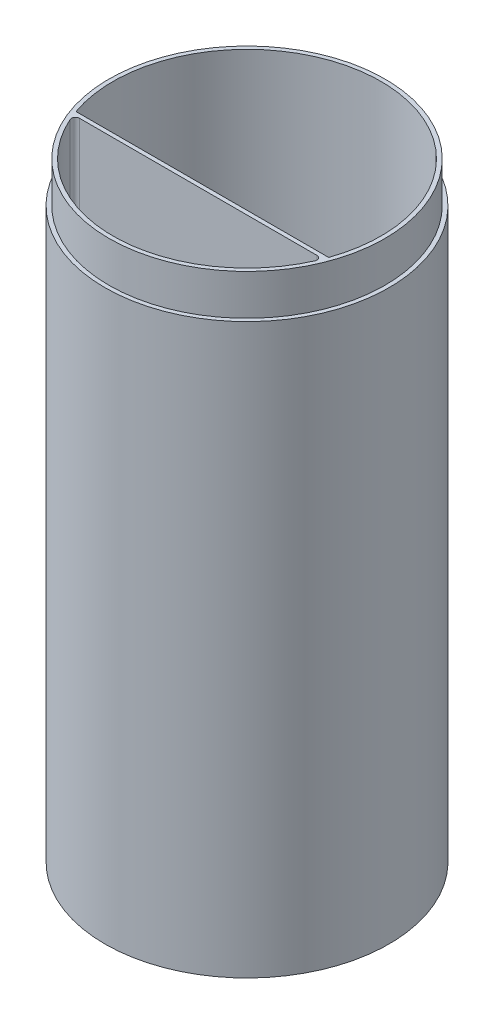
ISO-10303-21;
HEADER;
FILE_DESCRIPTION(('STEP AP214'),'2;1');
FILE_NAME('part.step','',(''),(''),'','','');
FILE_SCHEMA(('AUTOMOTIVE_DESIGN { 1 0 10303 214 1 1 1 1 }'));
ENDSEC;
DATA;
#1=APPLICATION_CONTEXT('core data for automotive mechanical design processes');
#2=APPLICATION_PROTOCOL_DEFINITION('international standard','automotive_design',2000,#1);
#3=PRODUCT_CONTEXT('',#1,'mechanical');
#4=PRODUCT('Part','Part','',(#3));
#5=PRODUCT_RELATED_PRODUCT_CATEGORY('part','',(#4));
#6=PRODUCT_DEFINITION_FORMATION('','',#4);
#7=PRODUCT_DEFINITION_CONTEXT('part definition',#1,'design');
#8=PRODUCT_DEFINITION('design','',#6,#7);
#9=PRODUCT_DEFINITION_SHAPE('','',#8);
#10=(LENGTH_UNIT() NAMED_UNIT(*) SI_UNIT(.MILLI.,.METRE.));
#11=(NAMED_UNIT(*) PLANE_ANGLE_UNIT() SI_UNIT($,.RADIAN.));
#12=(NAMED_UNIT(*) SI_UNIT($,.STERADIAN.) SOLID_ANGLE_UNIT());
#13=UNCERTAINTY_MEASURE_WITH_UNIT(LENGTH_MEASURE(1.E-05),#10,'distance_accuracy_value','');
#14=(GEOMETRIC_REPRESENTATION_CONTEXT(3) GLOBAL_UNCERTAINTY_ASSIGNED_CONTEXT((#13)) GLOBAL_UNIT_ASSIGNED_CONTEXT((#10,
#11,#12)) REPRESENTATION_CONTEXT('',''));
#15=CARTESIAN_POINT('',(0.,0.,0.));
#16=DIRECTION('',(0.,0.,1.));
#17=DIRECTION('',(1.,0.,0.));
#18=AXIS2_PLACEMENT_3D('',#15,#16,#17);
#19=CARTESIAN_POINT('',(-31.4483703870328,150.,10.));
#20=DIRECTION('',(0.,0.,-1.));
#21=DIRECTION('',(-1.,0.,0.));
#22=AXIS2_PLACEMENT_3D('',#19,#20,#21);
#23=PLANE('',#22);
#24=DIRECTION('',(0.,1.,0.));
#25=VECTOR('',#24,1.);
#26=CARTESIAN_POINT('',(-30.7083050655682,150.,10.));
#27=LINE('',#26,#25);
#28=CARTESIAN_POINT('',(-30.7083050655682,0.,10.));
#29=VERTEX_POINT('',#28);
#30=CARTESIAN_POINT('',(-30.7083050655682,140.,10.));
#31=VERTEX_POINT('',#30);
#32=EDGE_CURVE('E463',#29,#31,#27,.T.);
#33=ORIENTED_EDGE('',*,*,#32,.T.);
#34=DIRECTION('',(-1.,0.,0.));
#35=VECTOR('',#34,1.);
#36=CARTESIAN_POINT('',(0.,140.,10.));
#37=LINE('',#36,#35);
#38=CARTESIAN_POINT('',(30.7083050655682,140.,10.));
#39=VERTEX_POINT('',#38);
#40=EDGE_CURVE('E92',#39,#31,#37,.T.);
#41=ORIENTED_EDGE('',*,*,#40,.F.);
#42=DIRECTION('',(0.,1.,0.));
#43=VECTOR('',#42,1.);
#44=CARTESIAN_POINT('',(30.7083050655682,0.,10.));
#45=LINE('',#44,#43);
#46=CARTESIAN_POINT('',(30.7083050655682,0.,10.));
#47=VERTEX_POINT('',#46);
#48=EDGE_CURVE('E467',#39,#47,#45,.F.);
#49=ORIENTED_EDGE('',*,*,#48,.T.);
#50=DIRECTION('',(1.,0.,0.));
#51=VECTOR('',#50,1.);
#52=CARTESIAN_POINT('',(-31.4483703870328,0.,10.));
#53=LINE('',#52,#51);
#54=EDGE_CURVE('E453',#29,#47,#53,.T.);
#55=ORIENTED_EDGE('',*,*,#54,.F.);
#56=EDGE_LOOP('',(#33,#41,#49,#55));
#57=FACE_BOUND('',#56,.T.);
#58=DIRECTION('',(1.,0.,0.));
#59=VECTOR('',#58,1.);
#60=CARTESIAN_POINT('',(-23.25,75.,10.));
#61=LINE('',#60,#59);
#62=CARTESIAN_POINT('',(-23.25,75.,10.));
#63=VERTEX_POINT('',#62);
#64=CARTESIAN_POINT('',(23.25,75.,10.));
#65=VERTEX_POINT('',#64);
#66=EDGE_CURVE('E260',#63,#65,#61,.T.);
#67=ORIENTED_EDGE('',*,*,#66,.F.);
#68=DIRECTION('',(0.,-1.,0.));
#69=VECTOR('',#68,1.);
#70=CARTESIAN_POINT('',(-23.25,11.,10.));
#71=LINE('',#70,#69);
#72=CARTESIAN_POINT('',(-23.25,5.,10.));
#73=VERTEX_POINT('',#72);
#74=EDGE_CURVE('E370',#63,#73,#71,.T.);
#75=ORIENTED_EDGE('',*,*,#74,.T.);
#76=DIRECTION('',(-1.,0.,0.));
#77=VECTOR('',#76,1.);
#78=CARTESIAN_POINT('',(-23.25,5.,10.));
#79=LINE('',#78,#77);
#80=CARTESIAN_POINT('',(23.25,5.,10.));
#81=VERTEX_POINT('',#80);
#82=EDGE_CURVE('E84',#81,#73,#79,.T.);
#83=ORIENTED_EDGE('',*,*,#82,.F.);
#84=DIRECTION('',(0.,-1.,0.));
#85=VECTOR('',#84,1.);
#86=CARTESIAN_POINT('',(23.25,11.,10.));
#87=LINE('',#86,#85);
#88=EDGE_CURVE('E373',#65,#81,#87,.T.);
#89=ORIENTED_EDGE('',*,*,#88,.F.);
#90=EDGE_LOOP('',(#67,#75,#83,#89));
#91=FACE_BOUND('',#90,.T.);
#92=ADVANCED_FACE('F68',(#57,#91),#23,.T.);
#93=CARTESIAN_POINT('',(0.,150.,0.));
#94=DIRECTION('',(0.,1.,0.));
#95=DIRECTION('',(0.,0.,1.));
#96=AXIS2_PLACEMENT_3D('',#93,#94,#95);
#97=PLANE('',#96);
#98=DIRECTION('',(1.,0.,0.));
#99=VECTOR('',#98,1.);
#100=CARTESIAN_POINT('',(0.,150.,11.));
#101=LINE('',#100,#99);
#102=CARTESIAN_POINT('',(-31.1126983722081,150.,11.));
#103=VERTEX_POINT('',#102);
#104=CARTESIAN_POINT('',(31.1126983722081,150.,11.));
#105=VERTEX_POINT('',#104);
#106=EDGE_CURVE('E369',#103,#105,#101,.T.);
#107=ORIENTED_EDGE('',*,*,#106,.F.);
#108=CARTESIAN_POINT('',(0.,150.,0.));
#109=DIRECTION('',(0.,1.,0.));
#110=DIRECTION('',(0.,0.,1.));
#111=AXIS2_PLACEMENT_3D('',#108,#109,#110);
#112=CIRCLE('',#111,33.);
#113=EDGE_CURVE('E449',#105,#103,#112,.T.);
#114=ORIENTED_EDGE('',*,*,#113,.F.);
#115=EDGE_LOOP('',(#107,#114));
#116=FACE_BOUND('',#115,.T.);
#117=DIRECTION('',(-1.,0.,0.));
#118=VECTOR('',#117,1.);
#119=CARTESIAN_POINT('',(-30.7408522978788,150.,12.));
#120=LINE('',#119,#118);
#121=CARTESIAN_POINT('',(29.2403830344269,150.,12.));
#122=VERTEX_POINT('',#121);
#123=CARTESIAN_POINT('',(-29.2403830344269,150.,12.));
#124=VERTEX_POINT('',#123);
#125=EDGE_CURVE('E437',#122,#124,#120,.T.);
#126=ORIENTED_EDGE('',*,*,#125,.F.);
#127=CARTESIAN_POINT('',(29.2403830344269,150.,13.));
#128=DIRECTION('',(0.,1.,0.));
#129=DIRECTION('',(0.,0.,1.));
#130=AXIS2_PLACEMENT_3D('',#127,#128,#129);
#131=CIRCLE('',#130,1.);
#132=CARTESIAN_POINT('',(30.1541450042527,150.,13.40625));
#133=VERTEX_POINT('',#132);
#134=EDGE_CURVE('E500',#122,#133,#131,.F.);
#135=ORIENTED_EDGE('',*,*,#134,.T.);
#136=CARTESIAN_POINT('',(0.,150.,0.));
#137=DIRECTION('',(0.,1.,0.));
#138=DIRECTION('',(0.,0.,1.));
#139=AXIS2_PLACEMENT_3D('',#136,#137,#138);
#140=CIRCLE('',#139,33.);
#141=CARTESIAN_POINT('',(-30.1541450042527,150.,13.40625));
#142=VERTEX_POINT('',#141);
#143=EDGE_CURVE('E433',#142,#133,#140,.T.);
#144=ORIENTED_EDGE('',*,*,#143,.F.);
#145=CARTESIAN_POINT('',(-29.2403830344269,150.,13.));
#146=DIRECTION('',(0.,1.,0.));
#147=DIRECTION('',(0.,0.,1.));
#148=AXIS2_PLACEMENT_3D('',#145,#146,#147);
#149=CIRCLE('',#148,1.);
#150=EDGE_CURVE('E12',#142,#124,#149,.F.);
#151=ORIENTED_EDGE('',*,*,#150,.T.);
#152=EDGE_LOOP('',(#126,#135,#144,#151));
#153=FACE_BOUND('',#152,.T.);
#154=CARTESIAN_POINT('',(0.,150.,0.));
#155=DIRECTION('',(0.,1.,0.));
#156=DIRECTION('',(0.,0.,1.));
#157=AXIS2_PLACEMENT_3D('',#154,#155,#156);
#158=CIRCLE('',#157,34.);
#159=CARTESIAN_POINT('',(0.,150.,34.));
#160=VERTEX_POINT('',#159);
#161=EDGE_CURVE('E417',#160,#160,#158,.T.);
#162=ORIENTED_EDGE('',*,*,#161,.T.);
#163=EDGE_LOOP('',(#162));
#164=FACE_BOUND('',#163,.T.);
#165=ADVANCED_FACE('F517',(#116,#153,#164),#97,.T.);
#166=CARTESIAN_POINT('',(0.,150.,0.));
#167=DIRECTION('',(0.,-1.,0.));
#168=DIRECTION('',(0.,0.,-1.));
#169=AXIS2_PLACEMENT_3D('',#166,#167,#168);
#170=CYLINDRICAL_SURFACE('',#169,35.);
#171=CARTESIAN_POINT('',(0.,0.,0.));
#172=DIRECTION('',(0.,1.,0.));
#173=DIRECTION('',(0.,0.,1.));
#174=AXIS2_PLACEMENT_3D('',#171,#172,#173);
#175=CIRCLE('',#174,35.);
#176=CARTESIAN_POINT('',(0.,0.,35.));
#177=VERTEX_POINT('',#176);
#178=EDGE_CURVE('E452',#177,#177,#175,.T.);
#179=ORIENTED_EDGE('',*,*,#178,.T.);
#180=EDGE_LOOP('',(#179));
#181=FACE_BOUND('',#180,.T.);
#182=CARTESIAN_POINT('',(0.,140.,0.));
#183=DIRECTION('',(0.,1.,0.));
#184=DIRECTION('',(0.,0.,1.));
#185=AXIS2_PLACEMENT_3D('',#182,#183,#184);
#186=CIRCLE('',#185,35.);
#187=CARTESIAN_POINT('',(0.,140.,35.));
#188=VERTEX_POINT('',#187);
#189=EDGE_CURVE('E425',#188,#188,#186,.T.);
#190=ORIENTED_EDGE('',*,*,#189,.F.);
#191=EDGE_LOOP('',(#190));
#192=FACE_BOUND('',#191,.T.);
#193=ADVANCED_FACE('F541',(#181,#192),#170,.T.);
#194=CARTESIAN_POINT('',(30.7083050655682,150.,9.));
#195=DIRECTION('',(0.,-1.,0.));
#196=DIRECTION('',(0.,0.,-1.));
#197=AXIS2_PLACEMENT_3D('',#194,#195,#196);
#198=CYLINDRICAL_SURFACE('',#197,1.);
#199=CARTESIAN_POINT('',(30.7083050655682,140.,9.));
#200=DIRECTION('',(0.,1.,0.));
#201=DIRECTION('',(0.,0.,1.));
#202=AXIS2_PLACEMENT_3D('',#199,#200,#201);
#203=CIRCLE('',#202,1.);
#204=CARTESIAN_POINT('',(31.6679395988672,140.,9.28125));
#205=VERTEX_POINT('',#204);
#206=EDGE_CURVE('E397',#205,#39,#203,.F.);
#207=ORIENTED_EDGE('',*,*,#206,.F.);
#208=DIRECTION('',(0.,-1.,0.));
#209=VECTOR('',#208,1.);
#210=CARTESIAN_POINT('',(31.6679395988672,150.,9.28125000000001));
#211=LINE('',#210,#209);
#212=CARTESIAN_POINT('',(31.6679395988672,0.,9.28125));
#213=VERTEX_POINT('',#212);
#214=EDGE_CURVE('E473',#213,#205,#211,.F.);
#215=ORIENTED_EDGE('',*,*,#214,.F.);
#216=CARTESIAN_POINT('',(30.7083050655682,0.,9.));
#217=DIRECTION('',(0.,1.,0.));
#218=DIRECTION('',(0.,0.,1.));
#219=AXIS2_PLACEMENT_3D('',#216,#217,#218);
#220=CIRCLE('',#219,1.);
#221=EDGE_CURVE('E491',#47,#213,#220,.T.);
#222=ORIENTED_EDGE('',*,*,#221,.F.);
#223=ORIENTED_EDGE('',*,*,#48,.F.);
#224=EDGE_LOOP('',(#207,#215,#222,#223));
#225=FACE_BOUND('',#224,.T.);
#226=ADVANCED_FACE('F556',(#225),#198,.F.);
#227=CARTESIAN_POINT('',(-30.7083050655682,150.,9.));
#228=DIRECTION('',(0.,-1.,0.));
#229=DIRECTION('',(0.,0.,-1.));
#230=AXIS2_PLACEMENT_3D('',#227,#228,#229);
#231=CYLINDRICAL_SURFACE('',#230,1.);
#232=CARTESIAN_POINT('',(-30.7083050655682,140.,9.));
#233=DIRECTION('',(0.,1.,0.));
#234=DIRECTION('',(0.,0.,1.));
#235=AXIS2_PLACEMENT_3D('',#232,#233,#234);
#236=CIRCLE('',#235,1.);
#237=CARTESIAN_POINT('',(-31.6679395988672,140.,9.28125000000001));
#238=VERTEX_POINT('',#237);
#239=EDGE_CURVE('E402',#31,#238,#236,.F.);
#240=ORIENTED_EDGE('',*,*,#239,.F.);
#241=ORIENTED_EDGE('',*,*,#32,.F.);
#242=CARTESIAN_POINT('',(-30.7083050655682,0.,9.));
#243=DIRECTION('',(0.,1.,0.));
#244=DIRECTION('',(0.,0.,1.));
#245=AXIS2_PLACEMENT_3D('',#242,#243,#244);
#246=CIRCLE('',#245,1.);
#247=CARTESIAN_POINT('',(-31.6679395988672,0.,9.28125));
#248=VERTEX_POINT('',#247);
#249=EDGE_CURVE('E494',#248,#29,#246,.T.);
#250=ORIENTED_EDGE('',*,*,#249,.F.);
#251=DIRECTION('',(0.,-1.,0.));
#252=VECTOR('',#251,1.);
#253=CARTESIAN_POINT('',(-31.6679395988672,150.,9.28125000000001));
#254=LINE('',#253,#252);
#255=EDGE_CURVE('E470',#238,#248,#254,.T.);
#256=ORIENTED_EDGE('',*,*,#255,.F.);
#257=EDGE_LOOP('',(#240,#241,#250,#256));
#258=FACE_BOUND('',#257,.T.);
#259=ADVANCED_FACE('F552',(#258),#231,.F.);
#260=CARTESIAN_POINT('',(0.,0.,0.));
#261=DIRECTION('',(0.,1.,0.));
#262=DIRECTION('',(0.,0.,1.));
#263=AXIS2_PLACEMENT_3D('',#260,#261,#262);
#264=PLANE('',#263);
#265=ORIENTED_EDGE('',*,*,#54,.T.);
#266=ORIENTED_EDGE('',*,*,#221,.T.);
#267=CARTESIAN_POINT('',(0.,0.,0.));
#268=DIRECTION('',(0.,1.,0.));
#269=DIRECTION('',(0.,0.,1.));
#270=AXIS2_PLACEMENT_3D('',#267,#268,#269);
#271=CIRCLE('',#270,33.);
#272=EDGE_CURVE('E442',#213,#248,#271,.T.);
#273=ORIENTED_EDGE('',*,*,#272,.T.);
#274=ORIENTED_EDGE('',*,*,#249,.T.);
#275=EDGE_LOOP('',(#265,#266,#273,#274));
#276=FACE_BOUND('',#275,.T.);
#277=ORIENTED_EDGE('',*,*,#178,.F.);
#278=EDGE_LOOP('',(#277));
#279=FACE_BOUND('',#278,.T.);
#280=DIRECTION('',(-1.,0.,0.));
#281=VECTOR('',#280,1.);
#282=CARTESIAN_POINT('',(-30.7408522978788,0.,12.));
#283=LINE('',#282,#281);
#284=CARTESIAN_POINT('',(29.2403830344269,0.,12.));
#285=VERTEX_POINT('',#284);
#286=CARTESIAN_POINT('',(-29.2403830344269,0.,12.));
#287=VERTEX_POINT('',#286);
#288=EDGE_CURVE('E438',#285,#287,#283,.T.);
#289=ORIENTED_EDGE('',*,*,#288,.T.);
#290=CARTESIAN_POINT('',(-29.2403830344269,0.,13.));
#291=DIRECTION('',(0.,1.,0.));
#292=DIRECTION('',(0.,0.,1.));
#293=AXIS2_PLACEMENT_3D('',#290,#291,#292);
#294=CIRCLE('',#293,1.);
#295=CARTESIAN_POINT('',(-30.1541450042527,0.,13.40625));
#296=VERTEX_POINT('',#295);
#297=EDGE_CURVE('E77',#287,#296,#294,.T.);
#298=ORIENTED_EDGE('',*,*,#297,.T.);
#299=CARTESIAN_POINT('',(0.,0.,0.));
#300=DIRECTION('',(0.,1.,0.));
#301=DIRECTION('',(0.,0.,1.));
#302=AXIS2_PLACEMENT_3D('',#299,#300,#301);
#303=CIRCLE('',#302,33.);
#304=CARTESIAN_POINT('',(30.1541450042527,0.,13.40625));
#305=VERTEX_POINT('',#304);
#306=EDGE_CURVE('E429',#296,#305,#303,.T.);
#307=ORIENTED_EDGE('',*,*,#306,.T.);
#308=CARTESIAN_POINT('',(29.2403830344269,0.,13.));
#309=DIRECTION('',(0.,1.,0.));
#310=DIRECTION('',(0.,0.,1.));
#311=AXIS2_PLACEMENT_3D('',#308,#309,#310);
#312=CIRCLE('',#311,1.);
#313=EDGE_CURVE('E497',#305,#285,#312,.T.);
#314=ORIENTED_EDGE('',*,*,#313,.T.);
#315=EDGE_LOOP('',(#289,#298,#307,#314));
#316=FACE_BOUND('',#315,.T.);
#317=ADVANCED_FACE('F505',(#276,#279,#316),#264,.F.);
#318=CARTESIAN_POINT('',(0.,150.,0.));
#319=DIRECTION('',(0.,-1.,0.));
#320=DIRECTION('',(0.,0.,-1.));
#321=AXIS2_PLACEMENT_3D('',#318,#319,#320);
#322=CYLINDRICAL_SURFACE('',#321,33.);
#323=ORIENTED_EDGE('',*,*,#272,.F.);
#324=ORIENTED_EDGE('',*,*,#214,.T.);
#325=CARTESIAN_POINT('',(0.,140.,0.));
#326=DIRECTION('',(0.,1.,0.));
#327=DIRECTION('',(0.,0.,1.));
#328=AXIS2_PLACEMENT_3D('',#325,#326,#327);
#329=CIRCLE('',#328,33.);
#330=CARTESIAN_POINT('',(31.1126983722081,140.,11.));
#331=VERTEX_POINT('',#330);
#332=EDGE_CURVE('E394',#331,#205,#329,.T.);
#333=ORIENTED_EDGE('',*,*,#332,.F.);
#334=DIRECTION('',(0.,1.,0.));
#335=VECTOR('',#334,1.);
#336=CARTESIAN_POINT('',(31.1126983722081,140.,11.));
#337=LINE('',#336,#335);
#338=EDGE_CURVE('E409',#331,#105,#337,.T.);
#339=ORIENTED_EDGE('',*,*,#338,.T.);
#340=ORIENTED_EDGE('',*,*,#113,.T.);
#341=DIRECTION('',(0.,1.,0.));
#342=VECTOR('',#341,1.);
#343=CARTESIAN_POINT('',(-31.1126983722081,140.,11.));
#344=LINE('',#343,#342);
#345=CARTESIAN_POINT('',(-31.1126983722081,140.,11.));
#346=VERTEX_POINT('',#345);
#347=EDGE_CURVE('E413',#346,#103,#344,.T.);
#348=ORIENTED_EDGE('',*,*,#347,.F.);
#349=CARTESIAN_POINT('',(0.,140.,0.));
#350=DIRECTION('',(0.,1.,0.));
#351=DIRECTION('',(0.,0.,1.));
#352=AXIS2_PLACEMENT_3D('',#349,#350,#351);
#353=CIRCLE('',#352,33.);
#354=EDGE_CURVE('E405',#238,#346,#353,.T.);
#355=ORIENTED_EDGE('',*,*,#354,.F.);
#356=ORIENTED_EDGE('',*,*,#255,.T.);
#357=EDGE_LOOP('',(#323,#324,#333,#339,#340,#348,#355,#356));
#358=FACE_BOUND('',#357,.T.);
#359=ADVANCED_FACE('F546',(#358),#322,.F.);
#360=CARTESIAN_POINT('',(0.,150.,0.));
#361=DIRECTION('',(0.,-1.,0.));
#362=DIRECTION('',(0.,0.,-1.));
#363=AXIS2_PLACEMENT_3D('',#360,#361,#362);
#364=CYLINDRICAL_SURFACE('',#363,33.);
#365=ORIENTED_EDGE('',*,*,#143,.T.);
#366=DIRECTION('',(0.,-1.,0.));
#367=VECTOR('',#366,1.);
#368=CARTESIAN_POINT('',(30.1541450042527,150.,13.40625));
#369=LINE('',#368,#367);
#370=EDGE_CURVE('E480',#133,#305,#369,.T.);
#371=ORIENTED_EDGE('',*,*,#370,.T.);
#372=ORIENTED_EDGE('',*,*,#306,.F.);
#373=DIRECTION('',(0.,-1.,0.));
#374=VECTOR('',#373,1.);
#375=CARTESIAN_POINT('',(-30.1541450042527,150.,13.40625));
#376=LINE('',#375,#374);
#377=EDGE_CURVE('E477',#296,#142,#376,.F.);
#378=ORIENTED_EDGE('',*,*,#377,.T.);
#379=EDGE_LOOP('',(#365,#371,#372,#378));
#380=FACE_BOUND('',#379,.T.);
#381=ADVANCED_FACE('F511',(#380),#364,.F.);
#382=CARTESIAN_POINT('',(-30.7408522978788,150.,12.));
#383=DIRECTION('',(0.,0.,1.));
#384=DIRECTION('',(1.,0.,0.));
#385=AXIS2_PLACEMENT_3D('',#382,#383,#384);
#386=PLANE('',#385);
#387=ORIENTED_EDGE('',*,*,#288,.F.);
#388=DIRECTION('',(0.,1.,0.));
#389=VECTOR('',#388,1.);
#390=CARTESIAN_POINT('',(29.2403830344269,150.,12.));
#391=LINE('',#390,#389);
#392=EDGE_CURVE('E488',#285,#122,#391,.T.);
#393=ORIENTED_EDGE('',*,*,#392,.T.);
#394=ORIENTED_EDGE('',*,*,#125,.T.);
#395=DIRECTION('',(0.,1.,0.));
#396=VECTOR('',#395,1.);
#397=CARTESIAN_POINT('',(-29.2403830344269,0.,12.));
#398=LINE('',#397,#396);
#399=EDGE_CURVE('E484',#124,#287,#398,.F.);
#400=ORIENTED_EDGE('',*,*,#399,.T.);
#401=EDGE_LOOP('',(#387,#393,#394,#400));
#402=FACE_BOUND('',#401,.T.);
#403=ADVANCED_FACE('F521',(#402),#386,.T.);
#404=CARTESIAN_POINT('',(29.2403830344269,150.,13.));
#405=DIRECTION('',(0.,-1.,0.));
#406=DIRECTION('',(0.,0.,-1.));
#407=AXIS2_PLACEMENT_3D('',#404,#405,#406);
#408=CYLINDRICAL_SURFACE('',#407,1.);
#409=ORIENTED_EDGE('',*,*,#134,.F.);
#410=ORIENTED_EDGE('',*,*,#392,.F.);
#411=ORIENTED_EDGE('',*,*,#313,.F.);
#412=ORIENTED_EDGE('',*,*,#370,.F.);
#413=EDGE_LOOP('',(#409,#410,#411,#412));
#414=FACE_BOUND('',#413,.T.);
#415=ADVANCED_FACE('F524',(#414),#408,.F.);
#416=CARTESIAN_POINT('',(-29.2403830344269,150.,13.));
#417=DIRECTION('',(0.,-1.,0.));
#418=DIRECTION('',(0.,0.,-1.));
#419=AXIS2_PLACEMENT_3D('',#416,#417,#418);
#420=CYLINDRICAL_SURFACE('',#419,1.);
#421=ORIENTED_EDGE('',*,*,#150,.F.);
#422=ORIENTED_EDGE('',*,*,#377,.F.);
#423=ORIENTED_EDGE('',*,*,#297,.F.);
#424=ORIENTED_EDGE('',*,*,#399,.F.);
#425=EDGE_LOOP('',(#421,#422,#423,#424));
#426=FACE_BOUND('',#425,.T.);
#427=ADVANCED_FACE('F70',(#426),#420,.F.);
#428=CARTESIAN_POINT('',(0.,140.,11.));
#429=DIRECTION('',(0.,0.,1.));
#430=DIRECTION('',(1.,0.,0.));
#431=AXIS2_PLACEMENT_3D('',#428,#429,#430);
#432=PLANE('',#431);
#433=ORIENTED_EDGE('',*,*,#106,.T.);
#434=ORIENTED_EDGE('',*,*,#338,.F.);
#435=DIRECTION('',(1.,0.,0.));
#436=VECTOR('',#435,1.);
#437=CARTESIAN_POINT('',(0.,140.,11.));
#438=LINE('',#437,#436);
#439=EDGE_CURVE('E390',#346,#331,#438,.T.);
#440=ORIENTED_EDGE('',*,*,#439,.F.);
#441=ORIENTED_EDGE('',*,*,#347,.T.);
#442=EDGE_LOOP('',(#433,#434,#440,#441));
#443=FACE_BOUND('',#442,.T.);
#444=ADVANCED_FACE('F530',(#443),#432,.F.);
#445=CARTESIAN_POINT('',(0.,140.,0.));
#446=DIRECTION('',(0.,1.,0.));
#447=DIRECTION('',(0.,0.,1.));
#448=AXIS2_PLACEMENT_3D('',#445,#446,#447);
#449=PLANE('',#448);
#450=ORIENTED_EDGE('',*,*,#439,.T.);
#451=ORIENTED_EDGE('',*,*,#332,.T.);
#452=ORIENTED_EDGE('',*,*,#206,.T.);
#453=ORIENTED_EDGE('',*,*,#40,.T.);
#454=ORIENTED_EDGE('',*,*,#239,.T.);
#455=ORIENTED_EDGE('',*,*,#354,.T.);
#456=EDGE_LOOP('',(#450,#451,#452,#453,#454,#455));
#457=FACE_BOUND('',#456,.T.);
#458=ADVANCED_FACE('F576',(#457),#449,.T.);
#459=CARTESIAN_POINT('',(0.,140.,0.));
#460=DIRECTION('',(0.,1.,0.));
#461=DIRECTION('',(0.,0.,1.));
#462=AXIS2_PLACEMENT_3D('',#459,#460,#461);
#463=CYLINDRICAL_SURFACE('',#462,34.);
#464=CARTESIAN_POINT('',(0.,140.,0.));
#465=DIRECTION('',(0.,1.,0.));
#466=DIRECTION('',(0.,0.,1.));
#467=AXIS2_PLACEMENT_3D('',#464,#465,#466);
#468=CIRCLE('',#467,34.);
#469=CARTESIAN_POINT('',(0.,140.,34.));
#470=VERTEX_POINT('',#469);
#471=EDGE_CURVE('E421',#470,#470,#468,.T.);
#472=ORIENTED_EDGE('',*,*,#471,.T.);
#473=EDGE_LOOP('',(#472));
#474=FACE_BOUND('',#473,.T.);
#475=ORIENTED_EDGE('',*,*,#161,.F.);
#476=EDGE_LOOP('',(#475));
#477=FACE_BOUND('',#476,.T.);
#478=ADVANCED_FACE('F585',(#474,#477),#463,.T.);
#479=CARTESIAN_POINT('',(0.,140.,0.));
#480=DIRECTION('',(0.,1.,0.));
#481=DIRECTION('',(0.,0.,1.));
#482=AXIS2_PLACEMENT_3D('',#479,#480,#481);
#483=PLANE('',#482);
#484=ORIENTED_EDGE('',*,*,#471,.F.);
#485=EDGE_LOOP('',(#484));
#486=FACE_BOUND('',#485,.T.);
#487=ORIENTED_EDGE('',*,*,#189,.T.);
#488=EDGE_LOOP('',(#487));
#489=FACE_BOUND('',#488,.T.);
#490=ADVANCED_FACE('F589',(#486,#489),#483,.T.);
#491=CARTESIAN_POINT('',(-11.,11.,0.));
#492=DIRECTION('',(0.,-1.,0.));
#493=DIRECTION('',(0.,0.,-1.));
#494=AXIS2_PLACEMENT_3D('',#491,#492,#493);
#495=CYLINDRICAL_SURFACE('',#494,12.25);
#496=CARTESIAN_POINT('',(-11.,5.,0.));
#497=DIRECTION('',(0.,-1.,0.));
#498=DIRECTION('',(0.,0.,-1.));
#499=AXIS2_PLACEMENT_3D('',#496,#497,#498);
#500=CIRCLE('',#499,12.25);
#501=CARTESIAN_POINT('',(-23.25,5.,0.));
#502=VERTEX_POINT('',#501);
#503=CARTESIAN_POINT('',(-11.,5.,-12.25));
#504=VERTEX_POINT('',#503);
#505=EDGE_CURVE('E332',#502,#504,#500,.T.);
#506=ORIENTED_EDGE('',*,*,#505,.F.);
#507=DIRECTION('',(0.,-1.,0.));
#508=VECTOR('',#507,1.);
#509=CARTESIAN_POINT('',(-23.25,11.,0.));
#510=LINE('',#509,#508);
#511=CARTESIAN_POINT('',(-23.25,75.,0.));
#512=VERTEX_POINT('',#511);
#513=EDGE_CURVE('E366',#512,#502,#510,.T.);
#514=ORIENTED_EDGE('',*,*,#513,.F.);
#515=CARTESIAN_POINT('',(-11.,75.,0.));
#516=DIRECTION('',(0.,1.,0.));
#517=DIRECTION('',(0.,0.,1.));
#518=AXIS2_PLACEMENT_3D('',#515,#516,#517);
#519=CIRCLE('',#518,12.25);
#520=CARTESIAN_POINT('',(-11.,75.,-12.25));
#521=VERTEX_POINT('',#520);
#522=EDGE_CURVE('E252',#521,#512,#519,.T.);
#523=ORIENTED_EDGE('',*,*,#522,.F.);
#524=DIRECTION('',(0.,-1.,0.));
#525=VECTOR('',#524,1.);
#526=CARTESIAN_POINT('',(-11.,11.,-12.25));
#527=LINE('',#526,#525);
#528=EDGE_CURVE('E365',#521,#504,#527,.T.);
#529=ORIENTED_EDGE('',*,*,#528,.T.);
#530=EDGE_LOOP('',(#506,#514,#523,#529));
#531=FACE_BOUND('',#530,.T.);
#532=ADVANCED_FACE('F592',(#531),#495,.T.);
#533=CARTESIAN_POINT('',(-23.25,11.,0.));
#534=DIRECTION('',(-1.,0.,0.));
#535=DIRECTION('',(0.,0.,1.));
#536=AXIS2_PLACEMENT_3D('',#533,#534,#535);
#537=PLANE('',#536);
#538=DIRECTION('',(0.,0.,-1.));
#539=VECTOR('',#538,1.);
#540=CARTESIAN_POINT('',(-23.25,5.,0.));
#541=LINE('',#540,#539);
#542=EDGE_CURVE('E361',#73,#502,#541,.T.);
#543=ORIENTED_EDGE('',*,*,#542,.F.);
#544=ORIENTED_EDGE('',*,*,#74,.F.);
#545=DIRECTION('',(0.,0.,1.));
#546=VECTOR('',#545,1.);
#547=CARTESIAN_POINT('',(-23.25,75.,0.));
#548=LINE('',#547,#546);
#549=EDGE_CURVE('E256',#512,#63,#548,.T.);
#550=ORIENTED_EDGE('',*,*,#549,.F.);
#551=ORIENTED_EDGE('',*,*,#513,.T.);
#552=EDGE_LOOP('',(#543,#544,#550,#551));
#553=FACE_BOUND('',#552,.T.);
#554=ADVANCED_FACE('F622',(#553),#537,.T.);
#555=CARTESIAN_POINT('',(23.25,11.,0.));
#556=DIRECTION('',(1.,0.,0.));
#557=DIRECTION('',(0.,0.,-1.));
#558=AXIS2_PLACEMENT_3D('',#555,#556,#557);
#559=PLANE('',#558);
#560=DIRECTION('',(0.,0.,1.));
#561=VECTOR('',#560,1.);
#562=CARTESIAN_POINT('',(23.25,5.,0.));
#563=LINE('',#562,#561);
#564=CARTESIAN_POINT('',(23.25,5.,0.));
#565=VERTEX_POINT('',#564);
#566=EDGE_CURVE('E355',#565,#81,#563,.T.);
#567=ORIENTED_EDGE('',*,*,#566,.F.);
#568=DIRECTION('',(0.,-1.,0.));
#569=VECTOR('',#568,1.);
#570=CARTESIAN_POINT('',(23.25,11.,0.));
#571=LINE('',#570,#569);
#572=CARTESIAN_POINT('',(23.25,75.,0.));
#573=VERTEX_POINT('',#572);
#574=EDGE_CURVE('E376',#573,#565,#571,.T.);
#575=ORIENTED_EDGE('',*,*,#574,.F.);
#576=DIRECTION('',(0.,0.,-1.));
#577=VECTOR('',#576,1.);
#578=CARTESIAN_POINT('',(23.25,75.,10.));
#579=LINE('',#578,#577);
#580=EDGE_CURVE('E264',#65,#573,#579,.T.);
#581=ORIENTED_EDGE('',*,*,#580,.F.);
#582=ORIENTED_EDGE('',*,*,#88,.T.);
#583=EDGE_LOOP('',(#567,#575,#581,#582));
#584=FACE_BOUND('',#583,.T.);
#585=ADVANCED_FACE('F629',(#584),#559,.T.);
#586=CARTESIAN_POINT('',(11.,11.,0.));
#587=DIRECTION('',(0.,-1.,0.));
#588=DIRECTION('',(0.,0.,-1.));
#589=AXIS2_PLACEMENT_3D('',#586,#587,#588);
#590=CYLINDRICAL_SURFACE('',#589,12.25);
#591=CARTESIAN_POINT('',(11.,5.,0.));
#592=DIRECTION('',(0.,-1.,0.));
#593=DIRECTION('',(0.,0.,-1.));
#594=AXIS2_PLACEMENT_3D('',#591,#592,#593);
#595=CIRCLE('',#594,12.25);
#596=CARTESIAN_POINT('',(11.,5.,-12.25));
#597=VERTEX_POINT('',#596);
#598=EDGE_CURVE('E351',#597,#565,#595,.T.);
#599=ORIENTED_EDGE('',*,*,#598,.F.);
#600=DIRECTION('',(0.,-1.,0.));
#601=VECTOR('',#600,1.);
#602=CARTESIAN_POINT('',(11.,11.,-12.25));
#603=LINE('',#602,#601);
#604=CARTESIAN_POINT('',(11.,75.,-12.25));
#605=VERTEX_POINT('',#604);
#606=EDGE_CURVE('E379',#605,#597,#603,.T.);
#607=ORIENTED_EDGE('',*,*,#606,.F.);
#608=CARTESIAN_POINT('',(11.,75.,0.));
#609=DIRECTION('',(0.,1.,0.));
#610=DIRECTION('',(0.,0.,1.));
#611=AXIS2_PLACEMENT_3D('',#608,#609,#610);
#612=CIRCLE('',#611,12.25);
#613=EDGE_CURVE('E268',#573,#605,#612,.T.);
#614=ORIENTED_EDGE('',*,*,#613,.F.);
#615=ORIENTED_EDGE('',*,*,#574,.T.);
#616=EDGE_LOOP('',(#599,#607,#614,#615));
#617=FACE_BOUND('',#616,.T.);
#618=ADVANCED_FACE('F637',(#617),#590,.T.);
#619=CARTESIAN_POINT('',(7.5,11.,-10.75));
#620=DIRECTION('',(-0.393919298579166,0.,-0.919145030018058));
#621=DIRECTION('',(-0.919145030018058,0.,0.393919298579167));
#622=AXIS2_PLACEMENT_3D('',#619,#620,#621);
#623=PLANE('',#622);
#624=DIRECTION('',(0.919145030018058,0.,-0.393919298579167));
#625=VECTOR('',#624,1.);
#626=CARTESIAN_POINT('',(7.5,5.,-10.75));
#627=LINE('',#626,#625);
#628=CARTESIAN_POINT('',(7.5,5.,-10.75));
#629=VERTEX_POINT('',#628);
#630=EDGE_CURVE('E347',#629,#597,#627,.T.);
#631=ORIENTED_EDGE('',*,*,#630,.F.);
#632=DIRECTION('',(0.,-1.,0.));
#633=VECTOR('',#632,1.);
#634=CARTESIAN_POINT('',(7.5,11.,-10.75));
#635=LINE('',#634,#633);
#636=CARTESIAN_POINT('',(7.5,75.,-10.75));
#637=VERTEX_POINT('',#636);
#638=EDGE_CURVE('E382',#637,#629,#635,.T.);
#639=ORIENTED_EDGE('',*,*,#638,.F.);
#640=DIRECTION('',(-0.919145030018058,0.,0.393919298579167));
#641=VECTOR('',#640,1.);
#642=CARTESIAN_POINT('',(11.,75.,-12.25));
#643=LINE('',#642,#641);
#644=EDGE_CURVE('E272',#605,#637,#643,.T.);
#645=ORIENTED_EDGE('',*,*,#644,.F.);
#646=ORIENTED_EDGE('',*,*,#606,.T.);
#647=EDGE_LOOP('',(#631,#639,#645,#646));
#648=FACE_BOUND('',#647,.T.);
#649=ADVANCED_FACE('F645',(#648),#623,.T.);
#650=CARTESIAN_POINT('',(-7.5,11.,-10.75));
#651=DIRECTION('',(0.,0.,-1.));
#652=DIRECTION('',(-1.,0.,0.));
#653=AXIS2_PLACEMENT_3D('',#650,#651,#652);
#654=PLANE('',#653);
#655=DIRECTION('',(1.,0.,0.));
#656=VECTOR('',#655,1.);
#657=CARTESIAN_POINT('',(-7.5,5.,-10.75));
#658=LINE('',#657,#656);
#659=CARTESIAN_POINT('',(-7.5,5.,-10.75));
#660=VERTEX_POINT('',#659);
#661=EDGE_CURVE('E343',#660,#629,#658,.T.);
#662=ORIENTED_EDGE('',*,*,#661,.F.);
#663=DIRECTION('',(0.,-1.,0.));
#664=VECTOR('',#663,1.);
#665=CARTESIAN_POINT('',(-7.5,11.,-10.75));
#666=LINE('',#665,#664);
#667=CARTESIAN_POINT('',(-7.5,75.,-10.75));
#668=VERTEX_POINT('',#667);
#669=EDGE_CURVE('E385',#668,#660,#666,.T.);
#670=ORIENTED_EDGE('',*,*,#669,.F.);
#671=DIRECTION('',(-1.,0.,0.));
#672=VECTOR('',#671,1.);
#673=CARTESIAN_POINT('',(7.5,75.,-10.75));
#674=LINE('',#673,#672);
#675=EDGE_CURVE('E276',#637,#668,#674,.T.);
#676=ORIENTED_EDGE('',*,*,#675,.F.);
#677=ORIENTED_EDGE('',*,*,#638,.T.);
#678=EDGE_LOOP('',(#662,#670,#676,#677));
#679=FACE_BOUND('',#678,.T.);
#680=ADVANCED_FACE('F653',(#679),#654,.T.);
#681=CARTESIAN_POINT('',(-11.,11.,-12.25));
#682=DIRECTION('',(0.393919298579168,0.,-0.919145030018058));
#683=DIRECTION('',(-0.919145030018058,0.,-0.393919298579168));
#684=AXIS2_PLACEMENT_3D('',#681,#682,#683);
#685=PLANE('',#684);
#686=DIRECTION('',(0.919145030018058,0.,0.393919298579168));
#687=VECTOR('',#686,1.);
#688=CARTESIAN_POINT('',(-11.,5.,-12.25));
#689=LINE('',#688,#687);
#690=EDGE_CURVE('E339',#504,#660,#689,.T.);
#691=ORIENTED_EDGE('',*,*,#690,.F.);
#692=ORIENTED_EDGE('',*,*,#528,.F.);
#693=DIRECTION('',(-0.919145030018058,0.,-0.393919298579168));
#694=VECTOR('',#693,1.);
#695=CARTESIAN_POINT('',(-7.5,75.,-10.75));
#696=LINE('',#695,#694);
#697=EDGE_CURVE('E280',#668,#521,#696,.T.);
#698=ORIENTED_EDGE('',*,*,#697,.F.);
#699=ORIENTED_EDGE('',*,*,#669,.T.);
#700=EDGE_LOOP('',(#691,#692,#698,#699));
#701=FACE_BOUND('',#700,.T.);
#702=ADVANCED_FACE('F661',(#701),#685,.T.);
#703=CARTESIAN_POINT('',(-11.,5.,0.));
#704=DIRECTION('',(0.,-1.,0.));
#705=DIRECTION('',(0.,0.,-1.));
#706=AXIS2_PLACEMENT_3D('',#703,#704,#705);
#707=PLANE('',#706);
#708=CARTESIAN_POINT('',(0.,5.,7.5));
#709=DIRECTION('',(0.,-1.,0.));
#710=DIRECTION('',(0.,0.,-1.));
#711=AXIS2_PLACEMENT_3D('',#708,#709,#710);
#712=CIRCLE('',#711,2.25);
#713=CARTESIAN_POINT('',(0.,5.,5.25));
#714=VERTEX_POINT('',#713);
#715=EDGE_CURVE('E284',#714,#714,#712,.T.);
#716=ORIENTED_EDGE('',*,*,#715,.F.);
#717=EDGE_LOOP('',(#716));
#718=FACE_BOUND('',#717,.T.);
#719=CARTESIAN_POINT('',(-20.5,5.,7.5));
#720=DIRECTION('',(0.,-1.,0.));
#721=DIRECTION('',(0.,0.,-1.));
#722=AXIS2_PLACEMENT_3D('',#719,#720,#721);
#723=CIRCLE('',#722,2.25);
#724=CARTESIAN_POINT('',(-20.5,5.,5.25));
#725=VERTEX_POINT('',#724);
#726=EDGE_CURVE('E289',#725,#725,#723,.T.);
#727=ORIENTED_EDGE('',*,*,#726,.F.);
#728=EDGE_LOOP('',(#727));
#729=FACE_BOUND('',#728,.T.);
#730=CARTESIAN_POINT('',(20.5,5.,7.50000000000001));
#731=DIRECTION('',(0.,-1.,0.));
#732=DIRECTION('',(0.,0.,-1.));
#733=AXIS2_PLACEMENT_3D('',#730,#731,#732);
#734=CIRCLE('',#733,2.25);
#735=CARTESIAN_POINT('',(20.5,5.,5.25000000000001));
#736=VERTEX_POINT('',#735);
#737=EDGE_CURVE('E297',#736,#736,#734,.T.);
#738=ORIENTED_EDGE('',*,*,#737,.F.);
#739=EDGE_LOOP('',(#738));
#740=FACE_BOUND('',#739,.T.);
#741=CARTESIAN_POINT('',(-11.,5.,0.));
#742=DIRECTION('',(0.,-1.,0.));
#743=DIRECTION('',(0.,0.,-1.));
#744=AXIS2_PLACEMENT_3D('',#741,#742,#743);
#745=CIRCLE('',#744,9.25);
#746=CARTESIAN_POINT('',(-3.,5.,4.64354390525168));
#747=VERTEX_POINT('',#746);
#748=CARTESIAN_POINT('',(-3.,5.,-4.64354390525167));
#749=VERTEX_POINT('',#748);
#750=EDGE_CURVE('E305',#747,#749,#745,.T.);
#751=ORIENTED_EDGE('',*,*,#750,.F.);
#752=DIRECTION('',(-1.,0.,0.));
#753=VECTOR('',#752,1.);
#754=CARTESIAN_POINT('',(-3.,5.,4.64354390525168));
#755=LINE('',#754,#753);
#756=CARTESIAN_POINT('',(3.,5.,4.64354390525168));
#757=VERTEX_POINT('',#756);
#758=EDGE_CURVE('E316',#757,#747,#755,.T.);
#759=ORIENTED_EDGE('',*,*,#758,.F.);
#760=CARTESIAN_POINT('',(11.,5.,0.));
#761=DIRECTION('',(0.,-1.,0.));
#762=DIRECTION('',(0.,0.,-1.));
#763=AXIS2_PLACEMENT_3D('',#760,#761,#762);
#764=CIRCLE('',#763,9.25);
#765=CARTESIAN_POINT('',(3.,5.,-4.64354390525167));
#766=VERTEX_POINT('',#765);
#767=EDGE_CURVE('E313',#766,#757,#764,.T.);
#768=ORIENTED_EDGE('',*,*,#767,.F.);
#769=DIRECTION('',(1.,0.,0.));
#770=VECTOR('',#769,1.);
#771=CARTESIAN_POINT('',(-3.,5.,-4.64354390525167));
#772=LINE('',#771,#770);
#773=EDGE_CURVE('E225',#749,#766,#772,.T.);
#774=ORIENTED_EDGE('',*,*,#773,.F.);
#775=EDGE_LOOP('',(#751,#759,#768,#774));
#776=FACE_BOUND('',#775,.T.);
#777=CARTESIAN_POINT('',(0.,5.,-7.5));
#778=DIRECTION('',(0.,-1.,0.));
#779=DIRECTION('',(0.,0.,-1.));
#780=AXIS2_PLACEMENT_3D('',#777,#778,#779);
#781=CIRCLE('',#780,2.25);
#782=CARTESIAN_POINT('',(0.,5.,-9.75));
#783=VERTEX_POINT('',#782);
#784=EDGE_CURVE('E323',#783,#783,#781,.T.);
#785=ORIENTED_EDGE('',*,*,#784,.F.);
#786=EDGE_LOOP('',(#785));
#787=FACE_BOUND('',#786,.T.);
#788=ORIENTED_EDGE('',*,*,#505,.T.);
#789=ORIENTED_EDGE('',*,*,#690,.T.);
#790=ORIENTED_EDGE('',*,*,#661,.T.);
#791=ORIENTED_EDGE('',*,*,#630,.T.);
#792=ORIENTED_EDGE('',*,*,#598,.T.);
#793=ORIENTED_EDGE('',*,*,#566,.T.);
#794=ORIENTED_EDGE('',*,*,#82,.T.);
#795=ORIENTED_EDGE('',*,*,#542,.T.);
#796=EDGE_LOOP('',(#788,#789,#790,#791,#792,#793,#794,#795));
#797=FACE_BOUND('',#796,.T.);
#798=ADVANCED_FACE('F669',(#718,#729,#740,#776,#787,#797),#707,.T.);
#799=CARTESIAN_POINT('',(0.,11.,-7.5));
#800=DIRECTION('',(0.,-1.,0.));
#801=DIRECTION('',(0.,0.,-1.));
#802=AXIS2_PLACEMENT_3D('',#799,#800,#801);
#803=CYLINDRICAL_SURFACE('',#802,2.25);
#804=CARTESIAN_POINT('',(0.,11.,-7.5));
#805=DIRECTION('',(0.,-1.,0.));
#806=DIRECTION('',(0.,0.,-1.));
#807=AXIS2_PLACEMENT_3D('',#804,#805,#806);
#808=CIRCLE('',#807,2.25);
#809=CARTESIAN_POINT('',(0.,11.,-9.75));
#810=VERTEX_POINT('',#809);
#811=EDGE_CURVE('E328',#810,#810,#808,.T.);
#812=ORIENTED_EDGE('',*,*,#811,.F.);
#813=EDGE_LOOP('',(#812));
#814=FACE_BOUND('',#813,.T.);
#815=ORIENTED_EDGE('',*,*,#784,.T.);
#816=EDGE_LOOP('',(#815));
#817=FACE_BOUND('',#816,.T.);
#818=ADVANCED_FACE('F677',(#814,#817),#803,.F.);
#819=CARTESIAN_POINT('',(-11.,11.,0.));
#820=DIRECTION('',(0.,-1.,0.));
#821=DIRECTION('',(0.,0.,-1.));
#822=AXIS2_PLACEMENT_3D('',#819,#820,#821);
#823=CYLINDRICAL_SURFACE('',#822,9.25);
#824=ORIENTED_EDGE('',*,*,#750,.T.);
#825=DIRECTION('',(0.,-1.,0.));
#826=VECTOR('',#825,1.);
#827=CARTESIAN_POINT('',(-3.,11.,-4.64354390525167));
#828=LINE('',#827,#826);
#829=CARTESIAN_POINT('',(-3.,75.,-4.64354390525167));
#830=VERTEX_POINT('',#829);
#831=EDGE_CURVE('E231',#830,#749,#828,.T.);
#832=ORIENTED_EDGE('',*,*,#831,.F.);
#833=CARTESIAN_POINT('',(-11.,75.,0.));
#834=DIRECTION('',(0.,1.,0.));
#835=DIRECTION('',(0.,0.,1.));
#836=AXIS2_PLACEMENT_3D('',#833,#834,#835);
#837=CIRCLE('',#836,9.25);
#838=CARTESIAN_POINT('',(-3.,75.,4.64354390525168));
#839=VERTEX_POINT('',#838);
#840=EDGE_CURVE('E243',#830,#839,#837,.T.);
#841=ORIENTED_EDGE('',*,*,#840,.T.);
#842=DIRECTION('',(0.,-1.,0.));
#843=VECTOR('',#842,1.);
#844=CARTESIAN_POINT('',(-3.,11.,4.64354390525168));
#845=LINE('',#844,#843);
#846=EDGE_CURVE('E320',#839,#747,#845,.T.);
#847=ORIENTED_EDGE('',*,*,#846,.T.);
#848=EDGE_LOOP('',(#824,#832,#841,#847));
#849=FACE_BOUND('',#848,.T.);
#850=ADVANCED_FACE('F685',(#849),#823,.F.);
#851=CARTESIAN_POINT('',(-3.,11.,4.64354390525168));
#852=DIRECTION('',(0.,0.,1.));
#853=DIRECTION('',(1.,0.,0.));
#854=AXIS2_PLACEMENT_3D('',#851,#852,#853);
#855=PLANE('',#854);
#856=ORIENTED_EDGE('',*,*,#758,.T.);
#857=ORIENTED_EDGE('',*,*,#846,.F.);
#858=DIRECTION('',(1.,0.,0.));
#859=VECTOR('',#858,1.);
#860=CARTESIAN_POINT('',(3.,75.,4.64354390525168));
#861=LINE('',#860,#859);
#862=CARTESIAN_POINT('',(3.,75.,4.64354390525168));
#863=VERTEX_POINT('',#862);
#864=EDGE_CURVE('E247',#839,#863,#861,.T.);
#865=ORIENTED_EDGE('',*,*,#864,.T.);
#866=DIRECTION('',(0.,-1.,0.));
#867=VECTOR('',#866,1.);
#868=CARTESIAN_POINT('',(3.,11.,4.64354390525168));
#869=LINE('',#868,#867);
#870=EDGE_CURVE('E230',#863,#757,#869,.T.);
#871=ORIENTED_EDGE('',*,*,#870,.T.);
#872=EDGE_LOOP('',(#856,#857,#865,#871));
#873=FACE_BOUND('',#872,.T.);
#874=ADVANCED_FACE('F693',(#873),#855,.F.);
#875=CARTESIAN_POINT('',(11.,11.,0.));
#876=DIRECTION('',(0.,-1.,0.));
#877=DIRECTION('',(0.,0.,-1.));
#878=AXIS2_PLACEMENT_3D('',#875,#876,#877);
#879=CYLINDRICAL_SURFACE('',#878,9.25);
#880=ORIENTED_EDGE('',*,*,#767,.T.);
#881=ORIENTED_EDGE('',*,*,#870,.F.);
#882=CARTESIAN_POINT('',(11.,75.,0.));
#883=DIRECTION('',(0.,1.,0.));
#884=DIRECTION('',(0.,0.,1.));
#885=AXIS2_PLACEMENT_3D('',#882,#883,#884);
#886=CIRCLE('',#885,9.25);
#887=CARTESIAN_POINT('',(3.,75.,-4.64354390525167));
#888=VERTEX_POINT('',#887);
#889=EDGE_CURVE('E234',#863,#888,#886,.T.);
#890=ORIENTED_EDGE('',*,*,#889,.T.);
#891=DIRECTION('',(0.,-1.,0.));
#892=VECTOR('',#891,1.);
#893=CARTESIAN_POINT('',(3.,11.,-4.64354390525167));
#894=LINE('',#893,#892);
#895=EDGE_CURVE('E217',#888,#766,#894,.T.);
#896=ORIENTED_EDGE('',*,*,#895,.T.);
#897=EDGE_LOOP('',(#880,#881,#890,#896));
#898=FACE_BOUND('',#897,.T.);
#899=ADVANCED_FACE('F235',(#898),#879,.F.);
#900=CARTESIAN_POINT('',(-3.,11.,-4.64354390525167));
#901=DIRECTION('',(0.,0.,-1.));
#902=DIRECTION('',(-1.,0.,0.));
#903=AXIS2_PLACEMENT_3D('',#900,#901,#902);
#904=PLANE('',#903);
#905=ORIENTED_EDGE('',*,*,#773,.T.);
#906=ORIENTED_EDGE('',*,*,#895,.F.);
#907=DIRECTION('',(-1.,0.,0.));
#908=VECTOR('',#907,1.);
#909=CARTESIAN_POINT('',(-3.,75.,-4.64354390525167));
#910=LINE('',#909,#908);
#911=EDGE_CURVE('E222',#888,#830,#910,.T.);
#912=ORIENTED_EDGE('',*,*,#911,.T.);
#913=ORIENTED_EDGE('',*,*,#831,.T.);
#914=EDGE_LOOP('',(#905,#906,#912,#913));
#915=FACE_BOUND('',#914,.T.);
#916=ADVANCED_FACE('F219',(#915),#904,.F.);
#917=CARTESIAN_POINT('',(20.5,11.,7.50000000000001));
#918=DIRECTION('',(0.,-1.,0.));
#919=DIRECTION('',(0.,0.,-1.));
#920=AXIS2_PLACEMENT_3D('',#917,#918,#919);
#921=CYLINDRICAL_SURFACE('',#920,2.25);
#922=CARTESIAN_POINT('',(20.5,11.,7.50000000000001));
#923=DIRECTION('',(0.,-1.,0.));
#924=DIRECTION('',(0.,0.,-1.));
#925=AXIS2_PLACEMENT_3D('',#922,#923,#924);
#926=CIRCLE('',#925,2.25);
#927=CARTESIAN_POINT('',(20.5,11.,5.25000000000001));
#928=VERTEX_POINT('',#927);
#929=EDGE_CURVE('E301',#928,#928,#926,.T.);
#930=ORIENTED_EDGE('',*,*,#929,.F.);
#931=EDGE_LOOP('',(#930));
#932=FACE_BOUND('',#931,.T.);
#933=ORIENTED_EDGE('',*,*,#737,.T.);
#934=EDGE_LOOP('',(#933));
#935=FACE_BOUND('',#934,.T.);
#936=ADVANCED_FACE('F714',(#932,#935),#921,.F.);
#937=CARTESIAN_POINT('',(-20.5,11.,7.5));
#938=DIRECTION('',(0.,-1.,0.));
#939=DIRECTION('',(0.,0.,-1.));
#940=AXIS2_PLACEMENT_3D('',#937,#938,#939);
#941=CYLINDRICAL_SURFACE('',#940,2.25);
#942=CARTESIAN_POINT('',(-20.5,11.,7.5));
#943=DIRECTION('',(0.,-1.,0.));
#944=DIRECTION('',(0.,0.,-1.));
#945=AXIS2_PLACEMENT_3D('',#942,#943,#944);
#946=CIRCLE('',#945,2.25);
#947=CARTESIAN_POINT('',(-20.5,11.,5.25));
#948=VERTEX_POINT('',#947);
#949=EDGE_CURVE('E293',#948,#948,#946,.T.);
#950=ORIENTED_EDGE('',*,*,#949,.F.);
#951=EDGE_LOOP('',(#950));
#952=FACE_BOUND('',#951,.T.);
#953=ORIENTED_EDGE('',*,*,#726,.T.);
#954=EDGE_LOOP('',(#953));
#955=FACE_BOUND('',#954,.T.);
#956=ADVANCED_FACE('F721',(#952,#955),#941,.F.);
#957=CARTESIAN_POINT('',(0.,11.,7.5));
#958=DIRECTION('',(0.,-1.,0.));
#959=DIRECTION('',(0.,0.,-1.));
#960=AXIS2_PLACEMENT_3D('',#957,#958,#959);
#961=CYLINDRICAL_SURFACE('',#960,2.25);
#962=CARTESIAN_POINT('',(0.,11.,7.5));
#963=DIRECTION('',(0.,-1.,0.));
#964=DIRECTION('',(0.,0.,-1.));
#965=AXIS2_PLACEMENT_3D('',#962,#963,#964);
#966=CIRCLE('',#965,2.25);
#967=CARTESIAN_POINT('',(0.,11.,5.25));
#968=VERTEX_POINT('',#967);
#969=EDGE_CURVE('E285',#968,#968,#966,.T.);
#970=ORIENTED_EDGE('',*,*,#969,.F.);
#971=EDGE_LOOP('',(#970));
#972=FACE_BOUND('',#971,.T.);
#973=ORIENTED_EDGE('',*,*,#715,.T.);
#974=EDGE_LOOP('',(#973));
#975=FACE_BOUND('',#974,.T.);
#976=ADVANCED_FACE('F729',(#972,#975),#961,.F.);
#977=CARTESIAN_POINT('',(-11.,11.,0.));
#978=DIRECTION('',(0.,1.,0.));
#979=DIRECTION('',(0.,0.,1.));
#980=AXIS2_PLACEMENT_3D('',#977,#978,#979);
#981=PLANE('',#980);
#982=ORIENTED_EDGE('',*,*,#969,.T.);
#983=EDGE_LOOP('',(#982));
#984=FACE_BOUND('',#983,.T.);
#985=ADVANCED_FACE('F736',(#984),#981,.F.);
#986=ORIENTED_EDGE('',*,*,#949,.T.);
#987=EDGE_LOOP('',(#986));
#988=FACE_BOUND('',#987,.T.);
#989=ADVANCED_FACE('F743',(#988),#981,.F.);
#990=ORIENTED_EDGE('',*,*,#929,.T.);
#991=EDGE_LOOP('',(#990));
#992=FACE_BOUND('',#991,.T.);
#993=ADVANCED_FACE('F752',(#992),#981,.F.);
#994=CARTESIAN_POINT('',(-11.,75.,0.));
#995=DIRECTION('',(0.,1.,0.));
#996=DIRECTION('',(0.,0.,1.));
#997=AXIS2_PLACEMENT_3D('',#994,#995,#996);
#998=PLANE('',#997);
#999=ORIENTED_EDGE('',*,*,#522,.T.);
#1000=ORIENTED_EDGE('',*,*,#549,.T.);
#1001=ORIENTED_EDGE('',*,*,#66,.T.);
#1002=ORIENTED_EDGE('',*,*,#580,.T.);
#1003=ORIENTED_EDGE('',*,*,#613,.T.);
#1004=ORIENTED_EDGE('',*,*,#644,.T.);
#1005=ORIENTED_EDGE('',*,*,#675,.T.);
#1006=ORIENTED_EDGE('',*,*,#697,.T.);
#1007=EDGE_LOOP('',(#999,#1000,#1001,#1002,#1003,#1004,#1005,#1006));
#1008=FACE_BOUND('',#1007,.T.);
#1009=ORIENTED_EDGE('',*,*,#911,.F.);
#1010=ORIENTED_EDGE('',*,*,#889,.F.);
#1011=ORIENTED_EDGE('',*,*,#864,.F.);
#1012=ORIENTED_EDGE('',*,*,#840,.F.);
#1013=EDGE_LOOP('',(#1009,#1010,#1011,#1012));
#1014=FACE_BOUND('',#1013,.T.);
#1015=ADVANCED_FACE('F241',(#1008,#1014),#998,.T.);
#1016=ORIENTED_EDGE('',*,*,#811,.T.);
#1017=EDGE_LOOP('',(#1016));
#1018=FACE_BOUND('',#1017,.T.);
#1019=ADVANCED_FACE('F746',(#1018),#981,.F.);
#1020=CLOSED_SHELL('',(#92,#165,#193,#226,#259,#317,#359,#381,#403,#415,#427,#444,#458,#478,
#490,#532,#554,#585,#618,#649,#680,#702,#798,#818,#850,#874,#899,#916,#936,#956,#976,#985,#989,
#993,#1015,#1019));
#1021=MANIFOLD_SOLID_BREP('B2',#1020);
#1022=ADVANCED_BREP_SHAPE_REPRESENTATION('',(#18,#1021),#14);
#1023=SHAPE_DEFINITION_REPRESENTATION(#9,#1022);
ENDSEC;
END-ISO-10303-21;
